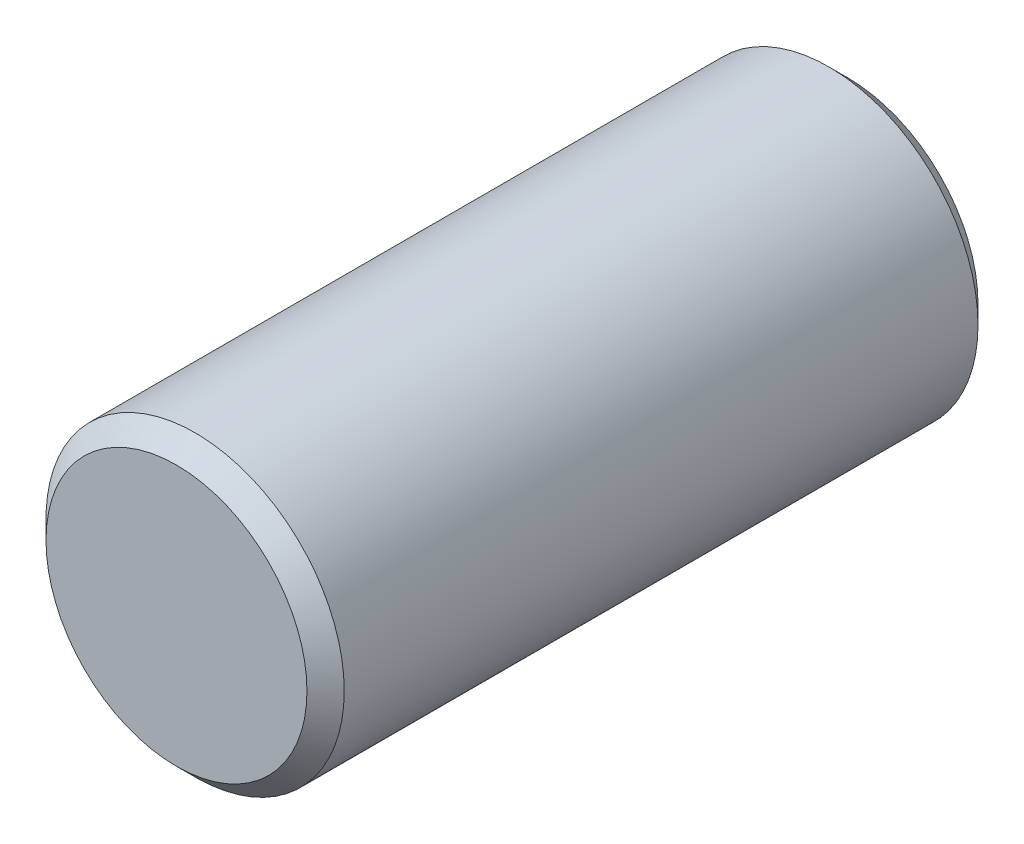
ISO-10303-21;
HEADER;
FILE_DESCRIPTION(('STEP AP214'),'2;1');
FILE_NAME('part.step','',(''),(''),'','','');
FILE_SCHEMA(('AUTOMOTIVE_DESIGN { 1 0 10303 214 1 1 1 1 }'));
ENDSEC;
DATA;
#1=APPLICATION_CONTEXT('core data for automotive mechanical design processes');
#2=APPLICATION_PROTOCOL_DEFINITION('international standard','automotive_design',2000,#1);
#3=PRODUCT_CONTEXT('',#1,'mechanical');
#4=PRODUCT('Part','Part','',(#3));
#5=PRODUCT_RELATED_PRODUCT_CATEGORY('part','',(#4));
#6=PRODUCT_DEFINITION_FORMATION('','',#4);
#7=PRODUCT_DEFINITION_CONTEXT('part definition',#1,'design');
#8=PRODUCT_DEFINITION('design','',#6,#7);
#9=PRODUCT_DEFINITION_SHAPE('','',#8);
#10=(LENGTH_UNIT() NAMED_UNIT(*) SI_UNIT(.MILLI.,.METRE.));
#11=(NAMED_UNIT(*) PLANE_ANGLE_UNIT() SI_UNIT($,.RADIAN.));
#12=(NAMED_UNIT(*) SI_UNIT($,.STERADIAN.) SOLID_ANGLE_UNIT());
#13=UNCERTAINTY_MEASURE_WITH_UNIT(LENGTH_MEASURE(1.E-05),#10,'distance_accuracy_value','');
#14=(GEOMETRIC_REPRESENTATION_CONTEXT(3) GLOBAL_UNCERTAINTY_ASSIGNED_CONTEXT((#13)) GLOBAL_UNIT_ASSIGNED_CONTEXT((#10,
#11,#12)) REPRESENTATION_CONTEXT('',''));
#15=CARTESIAN_POINT('',(0.,0.,0.));
#16=DIRECTION('',(0.,0.,1.));
#17=DIRECTION('',(1.,0.,0.));
#18=AXIS2_PLACEMENT_3D('',#15,#16,#17);
#19=CARTESIAN_POINT('',(0.,0.,18.));
#20=DIRECTION('',(0.,0.,-1.));
#21=DIRECTION('',(-1.,0.,0.));
#22=AXIS2_PLACEMENT_3D('',#19,#20,#21);
#23=CYLINDRICAL_SURFACE('',#22,4.);
#24=CARTESIAN_POINT('',(0.,0.,0.5));
#25=DIRECTION('',(0.,0.,1.));
#26=DIRECTION('',(1.,0.,0.));
#27=AXIS2_PLACEMENT_3D('',#24,#25,#26);
#28=CIRCLE('',#27,4.);
#29=CARTESIAN_POINT('',(4.,0.,0.5));
#30=VERTEX_POINT('',#29);
#31=EDGE_CURVE('E53',#30,#30,#28,.T.);
#32=ORIENTED_EDGE('',*,*,#31,.T.);
#33=EDGE_LOOP('',(#32));
#34=FACE_BOUND('',#33,.T.);
#35=CARTESIAN_POINT('',(0.,0.,17.5));
#36=DIRECTION('',(0.,0.,1.));
#37=DIRECTION('',(1.,0.,0.));
#38=AXIS2_PLACEMENT_3D('',#35,#36,#37);
#39=CIRCLE('',#38,4.);
#40=CARTESIAN_POINT('',(4.,0.,17.5));
#41=VERTEX_POINT('',#40);
#42=EDGE_CURVE('E58',#41,#41,#39,.F.);
#43=ORIENTED_EDGE('',*,*,#42,.T.);
#44=EDGE_LOOP('',(#43));
#45=FACE_BOUND('',#44,.T.);
#46=ADVANCED_FACE('F39',(#34,#45),#23,.T.);
#47=CARTESIAN_POINT('',(0.,0.,18.));
#48=DIRECTION('',(0.,0.,1.));
#49=DIRECTION('',(1.,0.,0.));
#50=AXIS2_PLACEMENT_3D('',#47,#48,#49);
#51=PLANE('',#50);
#52=CARTESIAN_POINT('',(0.,0.,18.));
#53=DIRECTION('',(0.,0.,1.));
#54=DIRECTION('',(1.,0.,0.));
#55=AXIS2_PLACEMENT_3D('',#52,#53,#54);
#56=CIRCLE('',#55,3.5);
#57=CARTESIAN_POINT('',(3.5,0.,18.));
#58=VERTEX_POINT('',#57);
#59=EDGE_CURVE('E10',#58,#58,#56,.T.);
#60=ORIENTED_EDGE('',*,*,#59,.T.);
#61=EDGE_LOOP('',(#60));
#62=FACE_BOUND('',#61,.T.);
#63=ADVANCED_FACE('F75',(#62),#51,.T.);
#64=CARTESIAN_POINT('',(0.,0.,0.));
#65=DIRECTION('',(0.,0.,1.));
#66=DIRECTION('',(1.,0.,0.));
#67=AXIS2_PLACEMENT_3D('',#64,#65,#66);
#68=PLANE('',#67);
#69=CARTESIAN_POINT('',(0.,0.,0.));
#70=DIRECTION('',(0.,0.,1.));
#71=DIRECTION('',(1.,0.,0.));
#72=AXIS2_PLACEMENT_3D('',#69,#70,#71);
#73=CIRCLE('',#72,3.5);
#74=CARTESIAN_POINT('',(3.5,0.,0.));
#75=VERTEX_POINT('',#74);
#76=EDGE_CURVE('E48',#75,#75,#73,.F.);
#77=ORIENTED_EDGE('',*,*,#76,.T.);
#78=EDGE_LOOP('',(#77));
#79=FACE_BOUND('',#78,.T.);
#80=ADVANCED_FACE('F72',(#79),#68,.F.);
#81=CARTESIAN_POINT('',(0.,0.,0.5));
#82=DIRECTION('',(0.,0.,1.));
#83=DIRECTION('',(1.,0.,0.));
#84=AXIS2_PLACEMENT_3D('',#81,#82,#83);
#85=CONICAL_SURFACE('',#84,4.,0.785398163397452);
#86=ORIENTED_EDGE('',*,*,#76,.F.);
#87=EDGE_LOOP('',(#86));
#88=FACE_BOUND('',#87,.T.);
#89=ORIENTED_EDGE('',*,*,#31,.F.);
#90=EDGE_LOOP('',(#89));
#91=FACE_BOUND('',#90,.T.);
#92=ADVANCED_FACE('F68',(#88,#91),#85,.T.);
#93=CARTESIAN_POINT('',(0.,0.,18.));
#94=DIRECTION('',(0.,0.,-1.));
#95=DIRECTION('',(-1.,0.,0.));
#96=AXIS2_PLACEMENT_3D('',#93,#94,#95);
#97=CONICAL_SURFACE('',#96,3.5,0.785398163397445);
#98=ORIENTED_EDGE('',*,*,#42,.F.);
#99=EDGE_LOOP('',(#98));
#100=FACE_BOUND('',#99,.T.);
#101=ORIENTED_EDGE('',*,*,#59,.F.);
#102=EDGE_LOOP('',(#101));
#103=FACE_BOUND('',#102,.T.);
#104=ADVANCED_FACE('F42',(#100,#103),#97,.T.);
#105=CLOSED_SHELL('',(#46,#63,#80,#92,#104));
#106=MANIFOLD_SOLID_BREP('B2',#105);
#107=ADVANCED_BREP_SHAPE_REPRESENTATION('',(#18,#106),#14);
#108=SHAPE_DEFINITION_REPRESENTATION(#9,#107);
ENDSEC;
END-ISO-10303-21;
